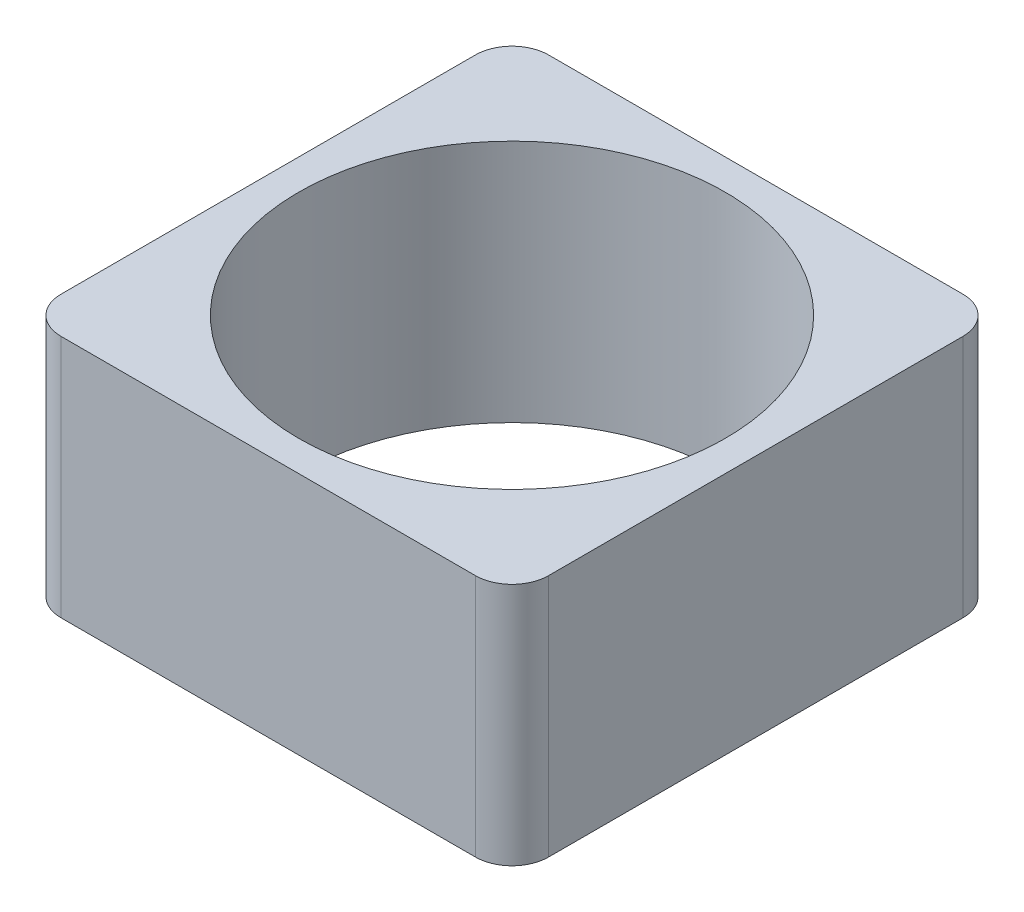
ISO-10303-21;
HEADER;
FILE_DESCRIPTION(('STEP AP214'),'2;1');
FILE_NAME('part.step','',(''),(''),'','','');
FILE_SCHEMA(('AUTOMOTIVE_DESIGN { 1 0 10303 214 1 1 1 1 }'));
ENDSEC;
DATA;
#1=APPLICATION_CONTEXT('core data for automotive mechanical design processes');
#2=APPLICATION_PROTOCOL_DEFINITION('international standard','automotive_design',2000,#1);
#3=PRODUCT_CONTEXT('',#1,'mechanical');
#4=PRODUCT('Part','Part','',(#3));
#5=PRODUCT_RELATED_PRODUCT_CATEGORY('part','',(#4));
#6=PRODUCT_DEFINITION_FORMATION('','',#4);
#7=PRODUCT_DEFINITION_CONTEXT('part definition',#1,'design');
#8=PRODUCT_DEFINITION('design','',#6,#7);
#9=PRODUCT_DEFINITION_SHAPE('','',#8);
#10=(LENGTH_UNIT() NAMED_UNIT(*) SI_UNIT(.MILLI.,.METRE.));
#11=(NAMED_UNIT(*) PLANE_ANGLE_UNIT() SI_UNIT($,.RADIAN.));
#12=(NAMED_UNIT(*) SI_UNIT($,.STERADIAN.) SOLID_ANGLE_UNIT());
#13=UNCERTAINTY_MEASURE_WITH_UNIT(LENGTH_MEASURE(1.E-05),#10,'distance_accuracy_value','');
#14=(GEOMETRIC_REPRESENTATION_CONTEXT(3) GLOBAL_UNCERTAINTY_ASSIGNED_CONTEXT((#13)) GLOBAL_UNIT_ASSIGNED_CONTEXT((#10,
#11,#12)) REPRESENTATION_CONTEXT('',''));
#15=CARTESIAN_POINT('',(0.,0.,0.));
#16=DIRECTION('',(0.,0.,1.));
#17=DIRECTION('',(1.,0.,0.));
#18=AXIS2_PLACEMENT_3D('',#15,#16,#17);
#19=CARTESIAN_POINT('',(20.,20.,20.));
#20=DIRECTION('',(-1.,0.,0.));
#21=DIRECTION('',(0.,0.,1.));
#22=AXIS2_PLACEMENT_3D('',#19,#20,#21);
#23=PLANE('',#22);
#24=DIRECTION('',(0.,0.,-1.));
#25=VECTOR('',#24,1.);
#26=CARTESIAN_POINT('',(20.,0.,20.));
#27=LINE('',#26,#25);
#28=CARTESIAN_POINT('',(20.,0.,17.));
#29=VERTEX_POINT('',#28);
#30=CARTESIAN_POINT('',(20.,0.,-17.));
#31=VERTEX_POINT('',#30);
#32=EDGE_CURVE('E129',#29,#31,#27,.T.);
#33=ORIENTED_EDGE('',*,*,#32,.T.);
#34=DIRECTION('',(0.,-1.,0.));
#35=VECTOR('',#34,1.);
#36=CARTESIAN_POINT('',(20.,20.,-17.));
#37=LINE('',#36,#35);
#38=CARTESIAN_POINT('',(20.,20.,-17.));
#39=VERTEX_POINT('',#38);
#40=EDGE_CURVE('E11',#31,#39,#37,.F.);
#41=ORIENTED_EDGE('',*,*,#40,.T.);
#42=DIRECTION('',(0.,0.,-1.));
#43=VECTOR('',#42,1.);
#44=CARTESIAN_POINT('',(20.,20.,20.));
#45=LINE('',#44,#43);
#46=CARTESIAN_POINT('',(20.,20.,17.));
#47=VERTEX_POINT('',#46);
#48=EDGE_CURVE('E127',#47,#39,#45,.T.);
#49=ORIENTED_EDGE('',*,*,#48,.F.);
#50=DIRECTION('',(0.,-1.,0.));
#51=VECTOR('',#50,1.);
#52=CARTESIAN_POINT('',(20.,20.,17.));
#53=LINE('',#52,#51);
#54=EDGE_CURVE('E41',#47,#29,#53,.T.);
#55=ORIENTED_EDGE('',*,*,#54,.T.);
#56=EDGE_LOOP('',(#33,#41,#49,#55));
#57=FACE_BOUND('',#56,.T.);
#58=ADVANCED_FACE('F33',(#57),#23,.F.);
#59=CARTESIAN_POINT('',(-20.,20.,-20.));
#60=DIRECTION('',(0.,0.,1.));
#61=DIRECTION('',(1.,0.,0.));
#62=AXIS2_PLACEMENT_3D('',#59,#60,#61);
#63=PLANE('',#62);
#64=DIRECTION('',(-1.,0.,0.));
#65=VECTOR('',#64,1.);
#66=CARTESIAN_POINT('',(-20.,0.,-20.));
#67=LINE('',#66,#65);
#68=CARTESIAN_POINT('',(17.,0.,-20.));
#69=VERTEX_POINT('',#68);
#70=CARTESIAN_POINT('',(-17.,0.,-20.));
#71=VERTEX_POINT('',#70);
#72=EDGE_CURVE('E125',#69,#71,#67,.T.);
#73=ORIENTED_EDGE('',*,*,#72,.T.);
#74=DIRECTION('',(0.,-1.,0.));
#75=VECTOR('',#74,1.);
#76=CARTESIAN_POINT('',(-17.,20.,-20.));
#77=LINE('',#76,#75);
#78=CARTESIAN_POINT('',(-17.,20.,-20.));
#79=VERTEX_POINT('',#78);
#80=EDGE_CURVE('E104',#71,#79,#77,.F.);
#81=ORIENTED_EDGE('',*,*,#80,.T.);
#82=DIRECTION('',(-1.,0.,0.));
#83=VECTOR('',#82,1.);
#84=CARTESIAN_POINT('',(-20.,20.,-20.));
#85=LINE('',#84,#83);
#86=CARTESIAN_POINT('',(17.,20.,-20.));
#87=VERTEX_POINT('',#86);
#88=EDGE_CURVE('E169',#87,#79,#85,.T.);
#89=ORIENTED_EDGE('',*,*,#88,.F.);
#90=DIRECTION('',(0.,-1.,0.));
#91=VECTOR('',#90,1.);
#92=CARTESIAN_POINT('',(17.,20.,-20.));
#93=LINE('',#92,#91);
#94=EDGE_CURVE('E109',#87,#69,#93,.T.);
#95=ORIENTED_EDGE('',*,*,#94,.T.);
#96=EDGE_LOOP('',(#73,#81,#89,#95));
#97=FACE_BOUND('',#96,.T.);
#98=ADVANCED_FACE('F186',(#97),#63,.F.);
#99=CARTESIAN_POINT('',(-20.,20.,20.));
#100=DIRECTION('',(1.,0.,0.));
#101=DIRECTION('',(0.,0.,-1.));
#102=AXIS2_PLACEMENT_3D('',#99,#100,#101);
#103=PLANE('',#102);
#104=DIRECTION('',(0.,0.,1.));
#105=VECTOR('',#104,1.);
#106=CARTESIAN_POINT('',(-20.,20.,20.));
#107=LINE('',#106,#105);
#108=CARTESIAN_POINT('',(-20.,20.,-17.));
#109=VERTEX_POINT('',#108);
#110=CARTESIAN_POINT('',(-20.,20.,17.));
#111=VERTEX_POINT('',#110);
#112=EDGE_CURVE('E118',#109,#111,#107,.T.);
#113=ORIENTED_EDGE('',*,*,#112,.F.);
#114=DIRECTION('',(0.,-1.,0.));
#115=VECTOR('',#114,1.);
#116=CARTESIAN_POINT('',(-20.,20.,-17.));
#117=LINE('',#116,#115);
#118=CARTESIAN_POINT('',(-20.,0.,-17.));
#119=VERTEX_POINT('',#118);
#120=EDGE_CURVE('E103',#109,#119,#117,.T.);
#121=ORIENTED_EDGE('',*,*,#120,.T.);
#122=DIRECTION('',(0.,0.,1.));
#123=VECTOR('',#122,1.);
#124=CARTESIAN_POINT('',(-20.,0.,20.));
#125=LINE('',#124,#123);
#126=CARTESIAN_POINT('',(-20.,0.,17.));
#127=VERTEX_POINT('',#126);
#128=EDGE_CURVE('E116',#119,#127,#125,.T.);
#129=ORIENTED_EDGE('',*,*,#128,.T.);
#130=DIRECTION('',(0.,-1.,0.));
#131=VECTOR('',#130,1.);
#132=CARTESIAN_POINT('',(-20.,20.,17.));
#133=LINE('',#132,#131);
#134=EDGE_CURVE('E120',#127,#111,#133,.F.);
#135=ORIENTED_EDGE('',*,*,#134,.T.);
#136=EDGE_LOOP('',(#113,#121,#129,#135));
#137=FACE_BOUND('',#136,.T.);
#138=ADVANCED_FACE('F115',(#137),#103,.F.);
#139=CARTESIAN_POINT('',(-20.,20.,20.));
#140=DIRECTION('',(0.,0.,-1.));
#141=DIRECTION('',(-1.,0.,0.));
#142=AXIS2_PLACEMENT_3D('',#139,#140,#141);
#143=PLANE('',#142);
#144=DIRECTION('',(1.,0.,0.));
#145=VECTOR('',#144,1.);
#146=CARTESIAN_POINT('',(-20.,20.,20.));
#147=LINE('',#146,#145);
#148=CARTESIAN_POINT('',(-17.,20.,20.));
#149=VERTEX_POINT('',#148);
#150=CARTESIAN_POINT('',(17.,20.,20.));
#151=VERTEX_POINT('',#150);
#152=EDGE_CURVE('E133',#149,#151,#147,.T.);
#153=ORIENTED_EDGE('',*,*,#152,.F.);
#154=DIRECTION('',(0.,-1.,0.));
#155=VECTOR('',#154,1.);
#156=CARTESIAN_POINT('',(-17.,20.,20.));
#157=LINE('',#156,#155);
#158=CARTESIAN_POINT('',(-17.,0.,20.));
#159=VERTEX_POINT('',#158);
#160=EDGE_CURVE('E150',#149,#159,#157,.T.);
#161=ORIENTED_EDGE('',*,*,#160,.T.);
#162=DIRECTION('',(1.,0.,0.));
#163=VECTOR('',#162,1.);
#164=CARTESIAN_POINT('',(-20.,0.,20.));
#165=LINE('',#164,#163);
#166=CARTESIAN_POINT('',(17.,0.,20.));
#167=VERTEX_POINT('',#166);
#168=EDGE_CURVE('E124',#159,#167,#165,.T.);
#169=ORIENTED_EDGE('',*,*,#168,.T.);
#170=DIRECTION('',(0.,-1.,0.));
#171=VECTOR('',#170,1.);
#172=CARTESIAN_POINT('',(17.,20.,20.));
#173=LINE('',#172,#171);
#174=EDGE_CURVE('E48',#167,#151,#173,.F.);
#175=ORIENTED_EDGE('',*,*,#174,.T.);
#176=EDGE_LOOP('',(#153,#161,#169,#175));
#177=FACE_BOUND('',#176,.T.);
#178=ADVANCED_FACE('F180',(#177),#143,.F.);
#179=CARTESIAN_POINT('',(0.,20.,0.));
#180=DIRECTION('',(0.,-1.,0.));
#181=DIRECTION('',(0.,0.,-1.));
#182=AXIS2_PLACEMENT_3D('',#179,#180,#181);
#183=PLANE('',#182);
#184=CARTESIAN_POINT('',(0.,20.,0.));
#185=DIRECTION('',(0.,1.,0.));
#186=DIRECTION('',(0.,0.,1.));
#187=AXIS2_PLACEMENT_3D('',#184,#185,#186);
#188=CIRCLE('',#187,17.5);
#189=CARTESIAN_POINT('',(0.,20.,17.5));
#190=VERTEX_POINT('',#189);
#191=EDGE_CURVE('E164',#190,#190,#188,.T.);
#192=ORIENTED_EDGE('',*,*,#191,.F.);
#193=EDGE_LOOP('',(#192));
#194=FACE_BOUND('',#193,.T.);
#195=ORIENTED_EDGE('',*,*,#88,.T.);
#196=CARTESIAN_POINT('',(-17.,20.,-17.));
#197=DIRECTION('',(0.,-1.,0.));
#198=DIRECTION('',(0.,0.,-1.));
#199=AXIS2_PLACEMENT_3D('',#196,#197,#198);
#200=CIRCLE('',#199,3.);
#201=EDGE_CURVE('E147',#79,#109,#200,.F.);
#202=ORIENTED_EDGE('',*,*,#201,.T.);
#203=ORIENTED_EDGE('',*,*,#112,.T.);
#204=CARTESIAN_POINT('',(-17.,20.,17.));
#205=DIRECTION('',(0.,-1.,0.));
#206=DIRECTION('',(0.,0.,-1.));
#207=AXIS2_PLACEMENT_3D('',#204,#205,#206);
#208=CIRCLE('',#207,3.);
#209=EDGE_CURVE('E55',#111,#149,#208,.F.);
#210=ORIENTED_EDGE('',*,*,#209,.T.);
#211=ORIENTED_EDGE('',*,*,#152,.T.);
#212=CARTESIAN_POINT('',(17.,20.,17.));
#213=DIRECTION('',(0.,-1.,0.));
#214=DIRECTION('',(0.,0.,-1.));
#215=AXIS2_PLACEMENT_3D('',#212,#213,#214);
#216=CIRCLE('',#215,3.);
#217=EDGE_CURVE('E142',#151,#47,#216,.F.);
#218=ORIENTED_EDGE('',*,*,#217,.T.);
#219=ORIENTED_EDGE('',*,*,#48,.T.);
#220=CARTESIAN_POINT('',(17.,20.,-17.));
#221=DIRECTION('',(0.,-1.,0.));
#222=DIRECTION('',(0.,0.,-1.));
#223=AXIS2_PLACEMENT_3D('',#220,#221,#222);
#224=CIRCLE('',#223,3.);
#225=EDGE_CURVE('E144',#39,#87,#224,.F.);
#226=ORIENTED_EDGE('',*,*,#225,.T.);
#227=EDGE_LOOP('',(#195,#202,#203,#210,#211,#218,#219,#226));
#228=FACE_BOUND('',#227,.T.);
#229=ADVANCED_FACE('F178',(#194,#228),#183,.F.);
#230=CARTESIAN_POINT('',(0.,0.,0.));
#231=DIRECTION('',(0.,-1.,0.));
#232=DIRECTION('',(0.,0.,-1.));
#233=AXIS2_PLACEMENT_3D('',#230,#231,#232);
#234=PLANE('',#233);
#235=CARTESIAN_POINT('',(0.,0.,0.));
#236=DIRECTION('',(0.,1.,0.));
#237=DIRECTION('',(0.,0.,1.));
#238=AXIS2_PLACEMENT_3D('',#235,#236,#237);
#239=CIRCLE('',#238,17.5);
#240=CARTESIAN_POINT('',(0.,0.,17.5));
#241=VERTEX_POINT('',#240);
#242=EDGE_CURVE('E162',#241,#241,#239,.T.);
#243=ORIENTED_EDGE('',*,*,#242,.T.);
#244=EDGE_LOOP('',(#243));
#245=FACE_BOUND('',#244,.T.);
#246=ORIENTED_EDGE('',*,*,#128,.F.);
#247=CARTESIAN_POINT('',(-17.,0.,-17.));
#248=DIRECTION('',(0.,-1.,0.));
#249=DIRECTION('',(0.,0.,-1.));
#250=AXIS2_PLACEMENT_3D('',#247,#248,#249);
#251=CIRCLE('',#250,3.);
#252=EDGE_CURVE('E99',#119,#71,#251,.T.);
#253=ORIENTED_EDGE('',*,*,#252,.T.);
#254=ORIENTED_EDGE('',*,*,#72,.F.);
#255=CARTESIAN_POINT('',(17.,0.,-17.));
#256=DIRECTION('',(0.,-1.,0.));
#257=DIRECTION('',(0.,0.,-1.));
#258=AXIS2_PLACEMENT_3D('',#255,#256,#257);
#259=CIRCLE('',#258,3.);
#260=EDGE_CURVE('E136',#69,#31,#259,.T.);
#261=ORIENTED_EDGE('',*,*,#260,.T.);
#262=ORIENTED_EDGE('',*,*,#32,.F.);
#263=CARTESIAN_POINT('',(17.,0.,17.));
#264=DIRECTION('',(0.,-1.,0.));
#265=DIRECTION('',(0.,0.,-1.));
#266=AXIS2_PLACEMENT_3D('',#263,#264,#265);
#267=CIRCLE('',#266,3.);
#268=EDGE_CURVE('E119',#29,#167,#267,.T.);
#269=ORIENTED_EDGE('',*,*,#268,.T.);
#270=ORIENTED_EDGE('',*,*,#168,.F.);
#271=CARTESIAN_POINT('',(-17.,0.,17.));
#272=DIRECTION('',(0.,-1.,0.));
#273=DIRECTION('',(0.,0.,-1.));
#274=AXIS2_PLACEMENT_3D('',#271,#272,#273);
#275=CIRCLE('',#274,3.);
#276=EDGE_CURVE('E110',#159,#127,#275,.T.);
#277=ORIENTED_EDGE('',*,*,#276,.T.);
#278=EDGE_LOOP('',(#246,#253,#254,#261,#262,#269,#270,#277));
#279=FACE_BOUND('',#278,.T.);
#280=ADVANCED_FACE('F122',(#245,#279),#234,.T.);
#281=CARTESIAN_POINT('',(-17.,20.,-17.));
#282=DIRECTION('',(0.,-1.,0.));
#283=DIRECTION('',(0.,0.,-1.));
#284=AXIS2_PLACEMENT_3D('',#281,#282,#283);
#285=CYLINDRICAL_SURFACE('',#284,3.);
#286=ORIENTED_EDGE('',*,*,#201,.F.);
#287=ORIENTED_EDGE('',*,*,#80,.F.);
#288=ORIENTED_EDGE('',*,*,#252,.F.);
#289=ORIENTED_EDGE('',*,*,#120,.F.);
#290=EDGE_LOOP('',(#286,#287,#288,#289));
#291=FACE_BOUND('',#290,.T.);
#292=ADVANCED_FACE('F102',(#291),#285,.T.);
#293=CARTESIAN_POINT('',(-17.,20.,17.));
#294=DIRECTION('',(0.,-1.,0.));
#295=DIRECTION('',(0.,0.,-1.));
#296=AXIS2_PLACEMENT_3D('',#293,#294,#295);
#297=CYLINDRICAL_SURFACE('',#296,3.);
#298=ORIENTED_EDGE('',*,*,#209,.F.);
#299=ORIENTED_EDGE('',*,*,#134,.F.);
#300=ORIENTED_EDGE('',*,*,#276,.F.);
#301=ORIENTED_EDGE('',*,*,#160,.F.);
#302=EDGE_LOOP('',(#298,#299,#300,#301));
#303=FACE_BOUND('',#302,.T.);
#304=ADVANCED_FACE('F196',(#303),#297,.T.);
#305=CARTESIAN_POINT('',(17.,20.,-17.));
#306=DIRECTION('',(0.,-1.,0.));
#307=DIRECTION('',(0.,0.,-1.));
#308=AXIS2_PLACEMENT_3D('',#305,#306,#307);
#309=CYLINDRICAL_SURFACE('',#308,3.);
#310=ORIENTED_EDGE('',*,*,#225,.F.);
#311=ORIENTED_EDGE('',*,*,#40,.F.);
#312=ORIENTED_EDGE('',*,*,#260,.F.);
#313=ORIENTED_EDGE('',*,*,#94,.F.);
#314=EDGE_LOOP('',(#310,#311,#312,#313));
#315=FACE_BOUND('',#314,.T.);
#316=ADVANCED_FACE('F188',(#315),#309,.T.);
#317=CARTESIAN_POINT('',(17.,20.,17.));
#318=DIRECTION('',(0.,-1.,0.));
#319=DIRECTION('',(0.,0.,-1.));
#320=AXIS2_PLACEMENT_3D('',#317,#318,#319);
#321=CYLINDRICAL_SURFACE('',#320,3.);
#322=ORIENTED_EDGE('',*,*,#217,.F.);
#323=ORIENTED_EDGE('',*,*,#174,.F.);
#324=ORIENTED_EDGE('',*,*,#268,.F.);
#325=ORIENTED_EDGE('',*,*,#54,.F.);
#326=EDGE_LOOP('',(#322,#323,#324,#325));
#327=FACE_BOUND('',#326,.T.);
#328=ADVANCED_FACE('F35',(#327),#321,.T.);
#329=CARTESIAN_POINT('',(0.,0.,0.));
#330=DIRECTION('',(0.,1.,0.));
#331=DIRECTION('',(0.,0.,1.));
#332=AXIS2_PLACEMENT_3D('',#329,#330,#331);
#333=CYLINDRICAL_SURFACE('',#332,17.5);
#334=ORIENTED_EDGE('',*,*,#242,.F.);
#335=EDGE_LOOP('',(#334));
#336=FACE_BOUND('',#335,.T.);
#337=ORIENTED_EDGE('',*,*,#191,.T.);
#338=EDGE_LOOP('',(#337));
#339=FACE_BOUND('',#338,.T.);
#340=ADVANCED_FACE('F176',(#336,#339),#333,.F.);
#341=CLOSED_SHELL('',(#58,#98,#138,#178,#229,#280,#292,#304,#316,#328,#340));
#342=MANIFOLD_SOLID_BREP('B2',#341);
#343=ADVANCED_BREP_SHAPE_REPRESENTATION('',(#18,#342),#14);
#344=SHAPE_DEFINITION_REPRESENTATION(#9,#343);
ENDSEC;
END-ISO-10303-21;
